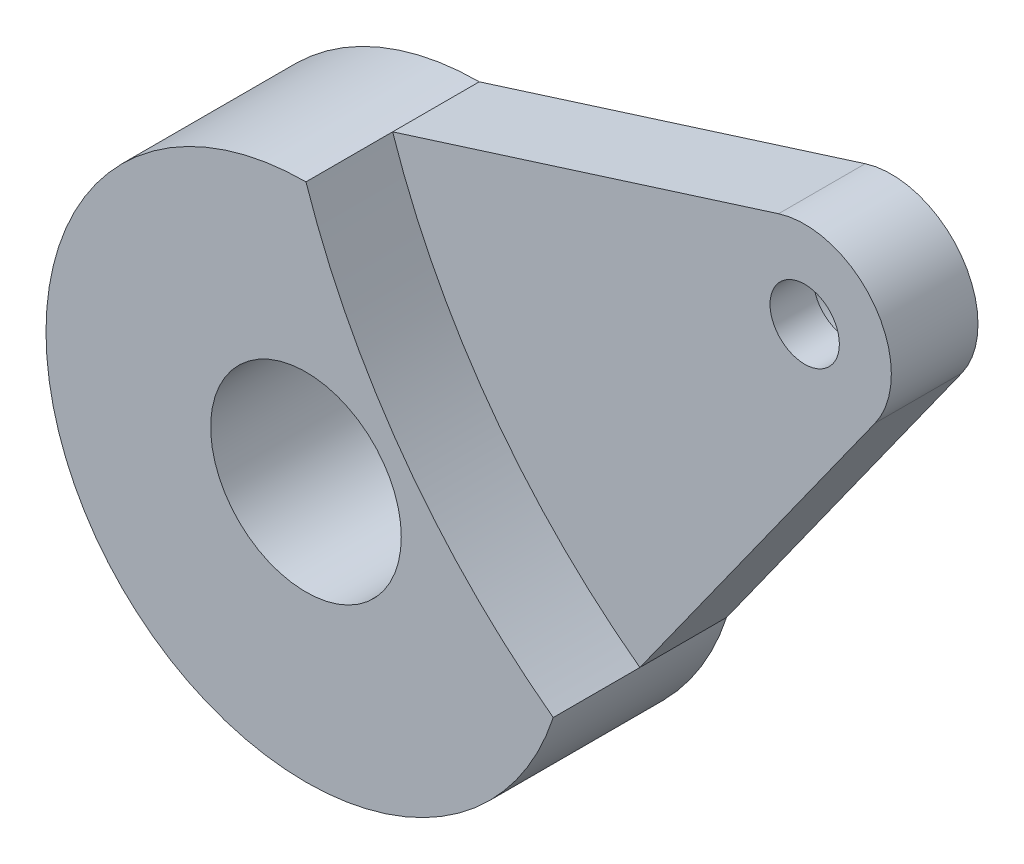
ISO-10303-21;
HEADER;
FILE_DESCRIPTION(('STEP AP214'),'2;1');
FILE_NAME('part.step','',(''),(''),'','','');
FILE_SCHEMA(('AUTOMOTIVE_DESIGN { 1 0 10303 214 1 1 1 1 }'));
ENDSEC;
DATA;
#1=APPLICATION_CONTEXT('core data for automotive mechanical design processes');
#2=APPLICATION_PROTOCOL_DEFINITION('international standard','automotive_design',2000,#1);
#3=PRODUCT_CONTEXT('',#1,'mechanical');
#4=PRODUCT('Part','Part','',(#3));
#5=PRODUCT_RELATED_PRODUCT_CATEGORY('part','',(#4));
#6=PRODUCT_DEFINITION_FORMATION('','',#4);
#7=PRODUCT_DEFINITION_CONTEXT('part definition',#1,'design');
#8=PRODUCT_DEFINITION('design','',#6,#7);
#9=PRODUCT_DEFINITION_SHAPE('','',#8);
#10=(LENGTH_UNIT() NAMED_UNIT(*) SI_UNIT(.MILLI.,.METRE.));
#11=(NAMED_UNIT(*) PLANE_ANGLE_UNIT() SI_UNIT($,.RADIAN.));
#12=(NAMED_UNIT(*) SI_UNIT($,.STERADIAN.) SOLID_ANGLE_UNIT());
#13=UNCERTAINTY_MEASURE_WITH_UNIT(LENGTH_MEASURE(1.E-05),#10,'distance_accuracy_value','');
#14=(GEOMETRIC_REPRESENTATION_CONTEXT(3) GLOBAL_UNCERTAINTY_ASSIGNED_CONTEXT((#13)) GLOBAL_UNIT_ASSIGNED_CONTEXT((#10,
#11,#12)) REPRESENTATION_CONTEXT('',''));
#15=CARTESIAN_POINT('',(0.,0.,0.));
#16=DIRECTION('',(0.,0.,1.));
#17=DIRECTION('',(1.,0.,0.));
#18=AXIS2_PLACEMENT_3D('',#15,#16,#17);
#19=CARTESIAN_POINT('',(47.5528258147571,34.5491502812526,20.));
#20=DIRECTION('',(0.,0.,-1.));
#21=DIRECTION('',(-1.,0.,0.));
#22=AXIS2_PLACEMENT_3D('',#19,#20,#21);
#23=CYLINDRICAL_SURFACE('',#22,4.00000000000001);
#24=CARTESIAN_POINT('',(47.5528258147571,34.5491502812526,5.));
#25=DIRECTION('',(0.,0.,-1.));
#26=DIRECTION('',(-1.,0.,0.));
#27=AXIS2_PLACEMENT_3D('',#24,#25,#26);
#28=CIRCLE('',#27,4.00000000000001);
#29=CARTESIAN_POINT('',(43.5528258147571,34.5491502812526,5.));
#30=VERTEX_POINT('',#29);
#31=EDGE_CURVE('E110',#30,#30,#28,.T.);
#32=ORIENTED_EDGE('',*,*,#31,.T.);
#33=EDGE_LOOP('',(#32));
#34=FACE_BOUND('',#33,.T.);
#35=CARTESIAN_POINT('',(47.5528258147571,34.5491502812526,10.));
#36=DIRECTION('',(0.,0.,1.));
#37=DIRECTION('',(1.,0.,0.));
#38=AXIS2_PLACEMENT_3D('',#35,#36,#37);
#39=CIRCLE('',#38,4.00000000000001);
#40=CARTESIAN_POINT('',(51.5528258147571,34.5491502812526,10.));
#41=VERTEX_POINT('',#40);
#42=EDGE_CURVE('E148',#41,#41,#39,.T.);
#43=ORIENTED_EDGE('',*,*,#42,.T.);
#44=EDGE_LOOP('',(#43));
#45=FACE_BOUND('',#44,.T.);
#46=ADVANCED_FACE('F35',(#34,#45),#23,.F.);
#47=CARTESIAN_POINT('',(47.5528258147571,34.5491502812526,20.));
#48=DIRECTION('',(0.,0.,-1.));
#49=DIRECTION('',(-1.,0.,0.));
#50=AXIS2_PLACEMENT_3D('',#47,#48,#49);
#51=CYLINDRICAL_SURFACE('',#50,9.99999999999999);
#52=CARTESIAN_POINT('',(47.5528258147571,34.5491502812526,10.));
#53=DIRECTION('',(0.,0.,1.));
#54=DIRECTION('',(1.,0.,0.));
#55=AXIS2_PLACEMENT_3D('',#52,#53,#54);
#56=CIRCLE('',#55,9.99999999999999);
#57=CARTESIAN_POINT('',(55.6891064401692,28.7352929055903,10.));
#58=VERTEX_POINT('',#57);
#59=CARTESIAN_POINT('',(44.5377678570787,44.0837937204086,10.));
#60=VERTEX_POINT('',#59);
#61=EDGE_CURVE('E84',#58,#60,#56,.T.);
#62=ORIENTED_EDGE('',*,*,#61,.F.);
#63=DIRECTION('',(0.,0.,-1.));
#64=VECTOR('',#63,1.);
#65=CARTESIAN_POINT('',(55.6891064401692,28.7352929055903,20.));
#66=LINE('',#65,#64);
#67=CARTESIAN_POINT('',(55.6891064401692,28.7352929055903,0.));
#68=VERTEX_POINT('',#67);
#69=EDGE_CURVE('E58',#58,#68,#66,.T.);
#70=ORIENTED_EDGE('',*,*,#69,.T.);
#71=CARTESIAN_POINT('',(47.5528258147571,34.5491502812526,0.));
#72=DIRECTION('',(0.,0.,1.));
#73=DIRECTION('',(1.,0.,0.));
#74=AXIS2_PLACEMENT_3D('',#71,#72,#73);
#75=CIRCLE('',#74,9.99999999999999);
#76=CARTESIAN_POINT('',(44.5377678570787,44.0837937204086,0.));
#77=VERTEX_POINT('',#76);
#78=EDGE_CURVE('E131',#68,#77,#75,.T.);
#79=ORIENTED_EDGE('',*,*,#78,.T.);
#80=DIRECTION('',(0.,0.,-1.));
#81=VECTOR('',#80,1.);
#82=CARTESIAN_POINT('',(44.5377678570787,44.0837937204086,20.));
#83=LINE('',#82,#81);
#84=EDGE_CURVE('E43',#60,#77,#83,.T.);
#85=ORIENTED_EDGE('',*,*,#84,.F.);
#86=EDGE_LOOP('',(#62,#70,#79,#85));
#87=FACE_BOUND('',#86,.T.);
#88=ADVANCED_FACE('F37',(#87),#51,.T.);
#89=CARTESIAN_POINT('',(44.5377678570787,44.0837937204086,20.));
#90=DIRECTION('',(0.301505795767843,-0.953464343915597,0.));
#91=DIRECTION('',(0.953464343915597,0.301505795767843,0.));
#92=AXIS2_PLACEMENT_3D('',#89,#90,#91);
#93=PLANE('',#92);
#94=DIRECTION('',(-0.953464343915597,-0.301505795767844,0.));
#95=VECTOR('',#94,1.);
#96=CARTESIAN_POINT('',(44.5377678570787,44.0837937204086,10.));
#97=LINE('',#96,#95);
#98=CARTESIAN_POINT('',(0.,30.,10.));
#99=VERTEX_POINT('',#98);
#100=EDGE_CURVE('E90',#60,#99,#97,.T.);
#101=ORIENTED_EDGE('',*,*,#100,.F.);
#102=ORIENTED_EDGE('',*,*,#84,.T.);
#103=DIRECTION('',(-0.953464343915597,-0.301505795767843,0.));
#104=VECTOR('',#103,1.);
#105=CARTESIAN_POINT('',(44.5377678570787,44.0837937204086,0.));
#106=LINE('',#105,#104);
#107=CARTESIAN_POINT('',(0.,30.,0.));
#108=VERTEX_POINT('',#107);
#109=EDGE_CURVE('E134',#77,#108,#106,.T.);
#110=ORIENTED_EDGE('',*,*,#109,.T.);
#111=DIRECTION('',(0.,0.,-1.));
#112=VECTOR('',#111,1.);
#113=CARTESIAN_POINT('',(0.,30.,20.));
#114=LINE('',#113,#112);
#115=EDGE_CURVE('E106',#99,#108,#114,.T.);
#116=ORIENTED_EDGE('',*,*,#115,.F.);
#117=EDGE_LOOP('',(#101,#102,#110,#116));
#118=FACE_BOUND('',#117,.T.);
#119=ADVANCED_FACE('F147',(#118),#93,.F.);
#120=CARTESIAN_POINT('',(55.6891064401692,28.7352929055903,20.));
#121=DIRECTION('',(-0.813628062541213,0.581385737566232,0.));
#122=DIRECTION('',(-0.581385737566232,-0.813628062541213,0.));
#123=AXIS2_PLACEMENT_3D('',#120,#121,#122);
#124=PLANE('',#123);
#125=DIRECTION('',(0.581385737566232,0.813628062541213,0.));
#126=VECTOR('',#125,1.);
#127=CARTESIAN_POINT('',(28.5316954888546,-9.27050983124832,10.));
#128=LINE('',#127,#126);
#129=CARTESIAN_POINT('',(28.5316954888546,-9.27050983124833,10.));
#130=VERTEX_POINT('',#129);
#131=EDGE_CURVE('E82',#130,#58,#128,.T.);
#132=ORIENTED_EDGE('',*,*,#131,.F.);
#133=DIRECTION('',(0.,0.,-1.));
#134=VECTOR('',#133,1.);
#135=CARTESIAN_POINT('',(28.5316954888546,-9.27050983124833,20.));
#136=LINE('',#135,#134);
#137=CARTESIAN_POINT('',(28.5316954888546,-9.27050983124833,0.));
#138=VERTEX_POINT('',#137);
#139=EDGE_CURVE('E96',#130,#138,#136,.T.);
#140=ORIENTED_EDGE('',*,*,#139,.T.);
#141=DIRECTION('',(0.581385737566232,0.813628062541213,0.));
#142=VECTOR('',#141,1.);
#143=CARTESIAN_POINT('',(55.6891064401692,28.7352929055903,0.));
#144=LINE('',#143,#142);
#145=EDGE_CURVE('E94',#138,#68,#144,.T.);
#146=ORIENTED_EDGE('',*,*,#145,.T.);
#147=ORIENTED_EDGE('',*,*,#69,.F.);
#148=EDGE_LOOP('',(#132,#140,#146,#147));
#149=FACE_BOUND('',#148,.T.);
#150=ADVANCED_FACE('F92',(#149),#124,.F.);
#151=CARTESIAN_POINT('',(47.5528258147571,34.5491502812526,0.));
#152=DIRECTION('',(0.,0.,1.));
#153=DIRECTION('',(1.,0.,0.));
#154=AXIS2_PLACEMENT_3D('',#151,#152,#153);
#155=PLANE('',#154);
#156=CARTESIAN_POINT('',(0.,0.,0.));
#157=DIRECTION('',(0.,0.,1.));
#158=DIRECTION('',(1.,0.,0.));
#159=AXIS2_PLACEMENT_3D('',#156,#157,#158);
#160=CIRCLE('',#159,11.);
#161=CARTESIAN_POINT('',(11.,0.,0.));
#162=VERTEX_POINT('',#161);
#163=EDGE_CURVE('E112',#162,#162,#160,.T.);
#164=ORIENTED_EDGE('',*,*,#163,.T.);
#165=EDGE_LOOP('',(#164));
#166=FACE_BOUND('',#165,.T.);
#167=CARTESIAN_POINT('',(0.,0.,0.));
#168=DIRECTION('',(0.,0.,-1.));
#169=DIRECTION('',(-1.,0.,0.));
#170=AXIS2_PLACEMENT_3D('',#167,#168,#169);
#171=CIRCLE('',#170,16.);
#172=CARTESIAN_POINT('',(-16.,0.,0.));
#173=VERTEX_POINT('',#172);
#174=EDGE_CURVE('E151',#173,#173,#171,.T.);
#175=ORIENTED_EDGE('',*,*,#174,.T.);
#176=EDGE_LOOP('',(#175));
#177=FACE_BOUND('',#176,.T.);
#178=ADVANCED_FACE('F161',(#166,#177),#155,.F.);
#179=CARTESIAN_POINT('',(47.5528258147571,34.5491502812526,20.));
#180=DIRECTION('',(0.,0.,1.));
#181=DIRECTION('',(1.,0.,0.));
#182=AXIS2_PLACEMENT_3D('',#179,#180,#181);
#183=PLANE('',#182);
#184=CARTESIAN_POINT('',(76.7005377963207,55.7262026299098,20.));
#185=DIRECTION('',(0.,0.,1.));
#186=DIRECTION('',(1.,0.,0.));
#187=AXIS2_PLACEMENT_3D('',#184,#185,#186);
#188=CIRCLE('',#187,80.9);
#189=CARTESIAN_POINT('',(0.,30.,20.));
#190=VERTEX_POINT('',#189);
#191=CARTESIAN_POINT('',(28.5316954888546,-9.27050983124832,20.));
#192=VERTEX_POINT('',#191);
#193=EDGE_CURVE('E154',#190,#192,#188,.T.);
#194=ORIENTED_EDGE('',*,*,#193,.F.);
#195=CARTESIAN_POINT('',(0.,0.,20.));
#196=DIRECTION('',(0.,0.,1.));
#197=DIRECTION('',(1.,0.,0.));
#198=AXIS2_PLACEMENT_3D('',#195,#196,#197);
#199=CIRCLE('',#198,30.);
#200=EDGE_CURVE('E97',#190,#192,#199,.T.);
#201=ORIENTED_EDGE('',*,*,#200,.T.);
#202=EDGE_LOOP('',(#194,#201));
#203=FACE_BOUND('',#202,.T.);
#204=CARTESIAN_POINT('',(0.,0.,20.));
#205=DIRECTION('',(0.,0.,1.));
#206=DIRECTION('',(1.,0.,0.));
#207=AXIS2_PLACEMENT_3D('',#204,#205,#206);
#208=CIRCLE('',#207,11.);
#209=CARTESIAN_POINT('',(11.,0.,20.));
#210=VERTEX_POINT('',#209);
#211=EDGE_CURVE('E117',#210,#210,#208,.T.);
#212=ORIENTED_EDGE('',*,*,#211,.F.);
#213=EDGE_LOOP('',(#212));
#214=FACE_BOUND('',#213,.T.);
#215=ADVANCED_FACE('F193',(#203,#214),#183,.T.);
#216=CARTESIAN_POINT('',(0.,0.,0.));
#217=DIRECTION('',(0.,0.,1.));
#218=DIRECTION('',(1.,0.,0.));
#219=AXIS2_PLACEMENT_3D('',#216,#217,#218);
#220=CIRCLE('',#219,20.);
#221=CARTESIAN_POINT('',(20.,0.,0.));
#222=VERTEX_POINT('',#221);
#223=EDGE_CURVE('E11',#222,#222,#220,.F.);
#224=ORIENTED_EDGE('',*,*,#223,.F.);
#225=EDGE_LOOP('',(#224));
#226=FACE_BOUND('',#225,.T.);
#227=CARTESIAN_POINT('',(47.5528258147571,34.5491502812526,0.));
#228=DIRECTION('',(0.,0.,-1.));
#229=DIRECTION('',(-1.,0.,0.));
#230=AXIS2_PLACEMENT_3D('',#227,#228,#229);
#231=CIRCLE('',#230,7.5);
#232=CARTESIAN_POINT('',(40.0528258147571,34.5491502812526,0.));
#233=VERTEX_POINT('',#232);
#234=EDGE_CURVE('E120',#233,#233,#231,.T.);
#235=ORIENTED_EDGE('',*,*,#234,.F.);
#236=EDGE_LOOP('',(#235));
#237=FACE_BOUND('',#236,.T.);
#238=ORIENTED_EDGE('',*,*,#78,.F.);
#239=ORIENTED_EDGE('',*,*,#145,.F.);
#240=CARTESIAN_POINT('',(0.,0.,0.));
#241=DIRECTION('',(0.,0.,1.));
#242=DIRECTION('',(1.,0.,0.));
#243=AXIS2_PLACEMENT_3D('',#240,#241,#242);
#244=CIRCLE('',#243,30.);
#245=EDGE_CURVE('E136',#108,#138,#244,.T.);
#246=ORIENTED_EDGE('',*,*,#245,.F.);
#247=ORIENTED_EDGE('',*,*,#109,.F.);
#248=EDGE_LOOP('',(#238,#239,#246,#247));
#249=FACE_BOUND('',#248,.T.);
#250=ADVANCED_FACE('F145',(#226,#237,#249),#155,.F.);
#251=CARTESIAN_POINT('',(0.,0.,20.));
#252=DIRECTION('',(0.,0.,-1.));
#253=DIRECTION('',(-1.,0.,0.));
#254=AXIS2_PLACEMENT_3D('',#251,#252,#253);
#255=CYLINDRICAL_SURFACE('',#254,30.);
#256=ORIENTED_EDGE('',*,*,#245,.T.);
#257=ORIENTED_EDGE('',*,*,#139,.F.);
#258=EDGE_CURVE('E99',#192,#130,#136,.T.);
#259=ORIENTED_EDGE('',*,*,#258,.F.);
#260=ORIENTED_EDGE('',*,*,#200,.F.);
#261=EDGE_CURVE('E107',#190,#99,#114,.T.);
#262=ORIENTED_EDGE('',*,*,#261,.T.);
#263=ORIENTED_EDGE('',*,*,#115,.T.);
#264=EDGE_LOOP('',(#256,#257,#259,#260,#262,#263));
#265=FACE_BOUND('',#264,.T.);
#266=ADVANCED_FACE('F140',(#265),#255,.T.);
#267=CARTESIAN_POINT('',(0.,0.,20.));
#268=DIRECTION('',(0.,0.,-1.));
#269=DIRECTION('',(-1.,0.,0.));
#270=AXIS2_PLACEMENT_3D('',#267,#268,#269);
#271=CYLINDRICAL_SURFACE('',#270,11.);
#272=ORIENTED_EDGE('',*,*,#211,.T.);
#273=EDGE_LOOP('',(#272));
#274=FACE_BOUND('',#273,.T.);
#275=ORIENTED_EDGE('',*,*,#163,.F.);
#276=EDGE_LOOP('',(#275));
#277=FACE_BOUND('',#276,.T.);
#278=ADVANCED_FACE('F189',(#274,#277),#271,.F.);
#279=CARTESIAN_POINT('',(47.5528258147571,34.5491502812526,5.));
#280=DIRECTION('',(0.,0.,-1.));
#281=DIRECTION('',(-1.,0.,0.));
#282=AXIS2_PLACEMENT_3D('',#279,#280,#281);
#283=CYLINDRICAL_SURFACE('',#282,7.5);
#284=CARTESIAN_POINT('',(47.5528258147571,34.5491502812526,5.));
#285=DIRECTION('',(0.,0.,-1.));
#286=DIRECTION('',(-1.,0.,0.));
#287=AXIS2_PLACEMENT_3D('',#284,#285,#286);
#288=CIRCLE('',#287,7.5);
#289=CARTESIAN_POINT('',(40.0528258147571,34.5491502812526,5.));
#290=VERTEX_POINT('',#289);
#291=EDGE_CURVE('E113',#290,#290,#288,.T.);
#292=ORIENTED_EDGE('',*,*,#291,.F.);
#293=EDGE_LOOP('',(#292));
#294=FACE_BOUND('',#293,.T.);
#295=ORIENTED_EDGE('',*,*,#234,.T.);
#296=EDGE_LOOP('',(#295));
#297=FACE_BOUND('',#296,.T.);
#298=ADVANCED_FACE('F187',(#294,#297),#283,.F.);
#299=CARTESIAN_POINT('',(47.5528258147571,34.5491502812526,5.));
#300=DIRECTION('',(0.,0.,-1.));
#301=DIRECTION('',(-1.,0.,0.));
#302=AXIS2_PLACEMENT_3D('',#299,#300,#301);
#303=PLANE('',#302);
#304=ORIENTED_EDGE('',*,*,#31,.F.);
#305=EDGE_LOOP('',(#304));
#306=FACE_BOUND('',#305,.T.);
#307=ORIENTED_EDGE('',*,*,#291,.T.);
#308=EDGE_LOOP('',(#307));
#309=FACE_BOUND('',#308,.T.);
#310=ADVANCED_FACE('F243',(#306,#309),#303,.T.);
#311=CARTESIAN_POINT('',(0.,0.,-10.));
#312=DIRECTION('',(0.,0.,-1.));
#313=DIRECTION('',(-1.,0.,0.));
#314=AXIS2_PLACEMENT_3D('',#311,#312,#313);
#315=PLANE('',#314);
#316=CARTESIAN_POINT('',(0.,0.,-10.));
#317=DIRECTION('',(0.,0.,-1.));
#318=DIRECTION('',(-1.,0.,0.));
#319=AXIS2_PLACEMENT_3D('',#316,#317,#318);
#320=CIRCLE('',#319,20.);
#321=CARTESIAN_POINT('',(-20.,0.,-10.));
#322=VERTEX_POINT('',#321);
#323=EDGE_CURVE('E125',#322,#322,#320,.T.);
#324=ORIENTED_EDGE('',*,*,#323,.T.);
#325=EDGE_LOOP('',(#324));
#326=FACE_BOUND('',#325,.T.);
#327=CARTESIAN_POINT('',(0.,0.,-10.));
#328=DIRECTION('',(0.,0.,-1.));
#329=DIRECTION('',(-1.,0.,0.));
#330=AXIS2_PLACEMENT_3D('',#327,#328,#329);
#331=CIRCLE('',#330,16.);
#332=CARTESIAN_POINT('',(-16.,0.,-10.));
#333=VERTEX_POINT('',#332);
#334=EDGE_CURVE('E156',#333,#333,#331,.T.);
#335=ORIENTED_EDGE('',*,*,#334,.F.);
#336=EDGE_LOOP('',(#335));
#337=FACE_BOUND('',#336,.T.);
#338=ADVANCED_FACE('F175',(#326,#337),#315,.T.);
#339=CARTESIAN_POINT('',(0.,0.,-10.));
#340=DIRECTION('',(0.,0.,1.));
#341=DIRECTION('',(1.,0.,0.));
#342=AXIS2_PLACEMENT_3D('',#339,#340,#341);
#343=CYLINDRICAL_SURFACE('',#342,20.);
#344=ORIENTED_EDGE('',*,*,#323,.F.);
#345=EDGE_LOOP('',(#344));
#346=FACE_BOUND('',#345,.T.);
#347=ORIENTED_EDGE('',*,*,#223,.T.);
#348=EDGE_LOOP('',(#347));
#349=FACE_BOUND('',#348,.T.);
#350=ADVANCED_FACE('F166',(#346,#349),#343,.T.);
#351=CARTESIAN_POINT('',(0.,0.,-10.));
#352=DIRECTION('',(0.,0.,1.));
#353=DIRECTION('',(1.,0.,0.));
#354=AXIS2_PLACEMENT_3D('',#351,#352,#353);
#355=CYLINDRICAL_SURFACE('',#354,16.);
#356=ORIENTED_EDGE('',*,*,#334,.T.);
#357=EDGE_LOOP('',(#356));
#358=FACE_BOUND('',#357,.T.);
#359=ORIENTED_EDGE('',*,*,#174,.F.);
#360=EDGE_LOOP('',(#359));
#361=FACE_BOUND('',#360,.T.);
#362=ADVANCED_FACE('F163',(#358,#361),#355,.F.);
#363=CARTESIAN_POINT('',(76.7005377963207,55.7262026299098,10.));
#364=DIRECTION('',(0.,0.,1.));
#365=DIRECTION('',(1.,0.,0.));
#366=AXIS2_PLACEMENT_3D('',#363,#364,#365);
#367=CYLINDRICAL_SURFACE('',#366,80.9);
#368=ORIENTED_EDGE('',*,*,#193,.T.);
#369=ORIENTED_EDGE('',*,*,#258,.T.);
#370=CARTESIAN_POINT('',(76.7005377963207,55.7262026299098,10.));
#371=DIRECTION('',(0.,0.,1.));
#372=DIRECTION('',(1.,0.,0.));
#373=AXIS2_PLACEMENT_3D('',#370,#371,#372);
#374=CIRCLE('',#373,80.9);
#375=EDGE_CURVE('E50',#99,#130,#374,.T.);
#376=ORIENTED_EDGE('',*,*,#375,.F.);
#377=ORIENTED_EDGE('',*,*,#261,.F.);
#378=EDGE_LOOP('',(#368,#369,#376,#377));
#379=FACE_BOUND('',#378,.T.);
#380=ADVANCED_FACE('F165',(#379),#367,.F.);
#381=CARTESIAN_POINT('',(76.7005377963207,55.7262026299098,10.));
#382=DIRECTION('',(0.,0.,1.));
#383=DIRECTION('',(1.,0.,0.));
#384=AXIS2_PLACEMENT_3D('',#381,#382,#383);
#385=PLANE('',#384);
#386=ORIENTED_EDGE('',*,*,#42,.F.);
#387=EDGE_LOOP('',(#386));
#388=FACE_BOUND('',#387,.T.);
#389=ORIENTED_EDGE('',*,*,#375,.T.);
#390=ORIENTED_EDGE('',*,*,#131,.T.);
#391=ORIENTED_EDGE('',*,*,#61,.T.);
#392=ORIENTED_EDGE('',*,*,#100,.T.);
#393=EDGE_LOOP('',(#389,#390,#391,#392));
#394=FACE_BOUND('',#393,.T.);
#395=ADVANCED_FACE('F83',(#388,#394),#385,.T.);
#396=CLOSED_SHELL('',(#46,#88,#119,#150,#178,#215,#250,#266,#278,#298,#310,#338,#350,#362,#380,#395));
#397=MANIFOLD_SOLID_BREP('B2',#396);
#398=ADVANCED_BREP_SHAPE_REPRESENTATION('',(#18,#397),#14);
#399=SHAPE_DEFINITION_REPRESENTATION(#9,#398);
ENDSEC;
END-ISO-10303-21;
